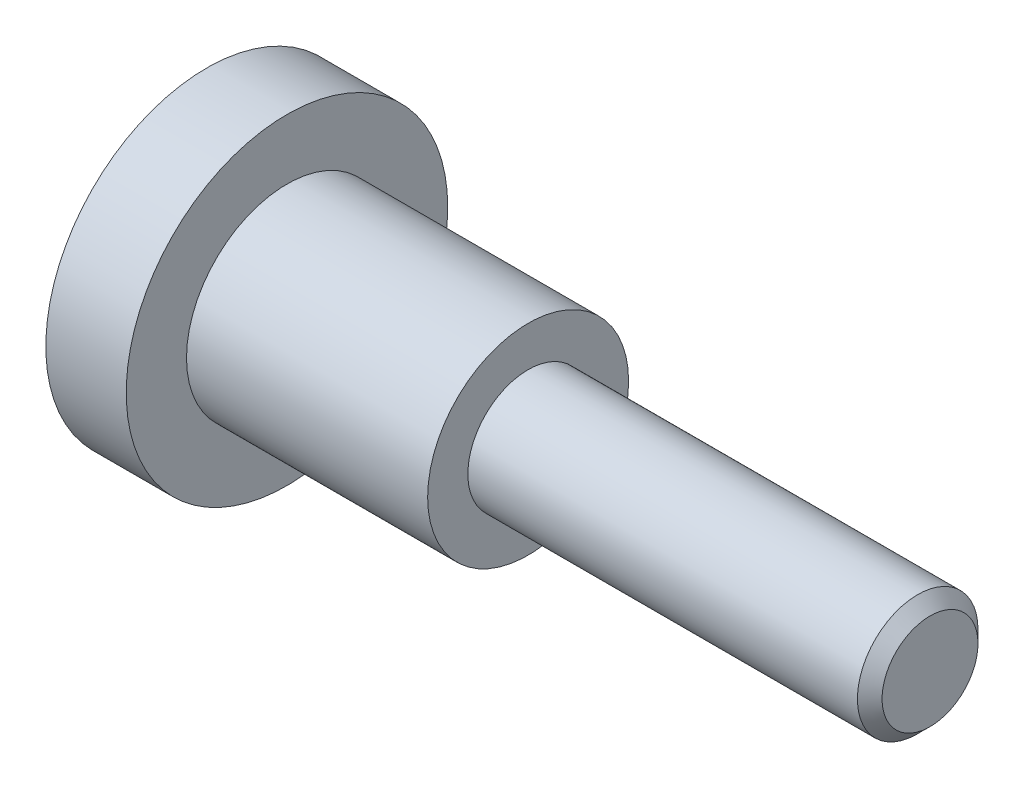
ISO-10303-21;
HEADER;
FILE_DESCRIPTION(('STEP AP214'),'2;1');
FILE_NAME('part.step','',(''),(''),'','','');
FILE_SCHEMA(('AUTOMOTIVE_DESIGN { 1 0 10303 214 1 1 1 1 }'));
ENDSEC;
DATA;
#1=APPLICATION_CONTEXT('core data for automotive mechanical design processes');
#2=APPLICATION_PROTOCOL_DEFINITION('international standard','automotive_design',2000,#1);
#3=PRODUCT_CONTEXT('',#1,'mechanical');
#4=PRODUCT('Part','Part','',(#3));
#5=PRODUCT_RELATED_PRODUCT_CATEGORY('part','',(#4));
#6=PRODUCT_DEFINITION_FORMATION('','',#4);
#7=PRODUCT_DEFINITION_CONTEXT('part definition',#1,'design');
#8=PRODUCT_DEFINITION('design','',#6,#7);
#9=PRODUCT_DEFINITION_SHAPE('','',#8);
#10=(LENGTH_UNIT() NAMED_UNIT(*) SI_UNIT(.MILLI.,.METRE.));
#11=(NAMED_UNIT(*) PLANE_ANGLE_UNIT() SI_UNIT($,.RADIAN.));
#12=(NAMED_UNIT(*) SI_UNIT($,.STERADIAN.) SOLID_ANGLE_UNIT());
#13=UNCERTAINTY_MEASURE_WITH_UNIT(LENGTH_MEASURE(1.E-05),#10,'distance_accuracy_value','');
#14=(GEOMETRIC_REPRESENTATION_CONTEXT(3) GLOBAL_UNCERTAINTY_ASSIGNED_CONTEXT((#13)) GLOBAL_UNIT_ASSIGNED_CONTEXT((#10,
#11,#12)) REPRESENTATION_CONTEXT('',''));
#15=CARTESIAN_POINT('',(0.,0.,0.));
#16=DIRECTION('',(0.,0.,1.));
#17=DIRECTION('',(1.,0.,0.));
#18=AXIS2_PLACEMENT_3D('',#15,#16,#17);
#19=CARTESIAN_POINT('',(-6.,0.,0.));
#20=DIRECTION('',(-1.,0.,0.));
#21=DIRECTION('',(0.,0.,1.));
#22=AXIS2_PLACEMENT_3D('',#19,#20,#21);
#23=PLANE('',#22);
#24=DIRECTION('',(0.,-1.,0.));
#25=VECTOR('',#24,1.);
#26=CARTESIAN_POINT('',(-6.,0.57735026918963,-1.));
#27=LINE('',#26,#25);
#28=CARTESIAN_POINT('',(-6.,0.57735026918963,-1.));
#29=VERTEX_POINT('',#28);
#30=CARTESIAN_POINT('',(-6.,0.,-1.));
#31=VERTEX_POINT('',#30);
#32=EDGE_CURVE('E229',#29,#31,#27,.T.);
#33=ORIENTED_EDGE('',*,*,#32,.T.);
#34=CARTESIAN_POINT('',(-6.,0.,0.));
#35=DIRECTION('',(1.,0.,0.));
#36=DIRECTION('',(0.,0.,-1.));
#37=AXIS2_PLACEMENT_3D('',#34,#35,#36);
#38=CIRCLE('',#37,1.);
#39=CARTESIAN_POINT('',(-6.,0.866025403784439,-0.5));
#40=VERTEX_POINT('',#39);
#41=EDGE_CURVE('E50',#31,#40,#38,.T.);
#42=ORIENTED_EDGE('',*,*,#41,.T.);
#43=DIRECTION('',(0.,-0.5,-0.866025403784439));
#44=VECTOR('',#43,1.);
#45=CARTESIAN_POINT('',(-6.,1.15470053837927,0.));
#46=LINE('',#45,#44);
#47=EDGE_CURVE('E257',#40,#29,#46,.T.);
#48=ORIENTED_EDGE('',*,*,#47,.T.);
#49=EDGE_LOOP('',(#33,#42,#48));
#50=FACE_BOUND('',#49,.T.);
#51=ADVANCED_FACE('F34',(#50),#23,.T.);
#52=CARTESIAN_POINT('',(-6.,1.15470053837927,0.));
#53=VERTEX_POINT('',#52);
#54=EDGE_CURVE('E255',#53,#40,#46,.T.);
#55=ORIENTED_EDGE('',*,*,#54,.T.);
#56=CARTESIAN_POINT('',(-6.,0.866025403784439,0.5));
#57=VERTEX_POINT('',#56);
#58=EDGE_CURVE('E201',#40,#57,#38,.T.);
#59=ORIENTED_EDGE('',*,*,#58,.T.);
#60=DIRECTION('',(0.,0.5,-0.866025403784439));
#61=VECTOR('',#60,1.);
#62=CARTESIAN_POINT('',(-6.,0.57735026918963,1.00000000000004));
#63=LINE('',#62,#61);
#64=EDGE_CURVE('E261',#57,#53,#63,.T.);
#65=ORIENTED_EDGE('',*,*,#64,.T.);
#66=EDGE_LOOP('',(#55,#59,#65));
#67=FACE_BOUND('',#66,.T.);
#68=ADVANCED_FACE('F122',(#67),#23,.T.);
#69=CARTESIAN_POINT('',(-6.,0.57735026918963,1.00000000000004));
#70=VERTEX_POINT('',#69);
#71=EDGE_CURVE('E258',#70,#57,#63,.T.);
#72=ORIENTED_EDGE('',*,*,#71,.T.);
#73=CARTESIAN_POINT('',(-6.,0.,1.));
#74=VERTEX_POINT('',#73);
#75=EDGE_CURVE('E204',#57,#74,#38,.T.);
#76=ORIENTED_EDGE('',*,*,#75,.T.);
#77=DIRECTION('',(0.,1.,0.));
#78=VECTOR('',#77,1.);
#79=CARTESIAN_POINT('',(-6.,-0.57735026918963,1.00000000000004));
#80=LINE('',#79,#78);
#81=EDGE_CURVE('E265',#74,#70,#80,.T.);
#82=ORIENTED_EDGE('',*,*,#81,.T.);
#83=EDGE_LOOP('',(#72,#76,#82));
#84=FACE_BOUND('',#83,.T.);
#85=ADVANCED_FACE('F127',(#84),#23,.T.);
#86=CARTESIAN_POINT('',(-6.,-0.57735026918963,1.00000000000004));
#87=VERTEX_POINT('',#86);
#88=EDGE_CURVE('E262',#87,#74,#80,.T.);
#89=ORIENTED_EDGE('',*,*,#88,.T.);
#90=CARTESIAN_POINT('',(-6.,-0.866025403784439,0.5));
#91=VERTEX_POINT('',#90);
#92=EDGE_CURVE('E209',#74,#91,#38,.T.);
#93=ORIENTED_EDGE('',*,*,#92,.T.);
#94=DIRECTION('',(0.,0.5,0.866025403784439));
#95=VECTOR('',#94,1.);
#96=CARTESIAN_POINT('',(-6.,-1.15470053837927,0.));
#97=LINE('',#96,#95);
#98=EDGE_CURVE('E268',#91,#87,#97,.T.);
#99=ORIENTED_EDGE('',*,*,#98,.T.);
#100=EDGE_LOOP('',(#89,#93,#99));
#101=FACE_BOUND('',#100,.T.);
#102=ADVANCED_FACE('F182',(#101),#23,.T.);
#103=CARTESIAN_POINT('',(-6.,-1.15470053837927,0.));
#104=VERTEX_POINT('',#103);
#105=EDGE_CURVE('E266',#104,#91,#97,.T.);
#106=ORIENTED_EDGE('',*,*,#105,.T.);
#107=CARTESIAN_POINT('',(-6.,-0.866025403784439,-0.5));
#108=VERTEX_POINT('',#107);
#109=EDGE_CURVE('E215',#91,#108,#38,.T.);
#110=ORIENTED_EDGE('',*,*,#109,.T.);
#111=DIRECTION('',(0.,-0.5,0.866025403784438));
#112=VECTOR('',#111,1.);
#113=CARTESIAN_POINT('',(-6.,-0.57735026918963,-1.));
#114=LINE('',#113,#112);
#115=EDGE_CURVE('E241',#108,#104,#114,.T.);
#116=ORIENTED_EDGE('',*,*,#115,.T.);
#117=EDGE_LOOP('',(#106,#110,#116));
#118=FACE_BOUND('',#117,.T.);
#119=ADVANCED_FACE('F120',(#118),#23,.T.);
#120=CARTESIAN_POINT('',(-8.,0.,0.));
#121=DIRECTION('',(1.,0.,0.));
#122=DIRECTION('',(0.,0.,-1.));
#123=AXIS2_PLACEMENT_3D('',#120,#121,#122);
#124=CYLINDRICAL_SURFACE('',#123,4.);
#125=CARTESIAN_POINT('',(-8.,0.,0.));
#126=DIRECTION('',(1.,0.,0.));
#127=DIRECTION('',(0.,0.,-1.));
#128=AXIS2_PLACEMENT_3D('',#125,#126,#127);
#129=CIRCLE('',#128,4.);
#130=CARTESIAN_POINT('',(-8.,0.,-4.));
#131=VERTEX_POINT('',#130);
#132=EDGE_CURVE('E187',#131,#131,#129,.T.);
#133=ORIENTED_EDGE('',*,*,#132,.T.);
#134=EDGE_LOOP('',(#133));
#135=FACE_BOUND('',#134,.T.);
#136=CARTESIAN_POINT('',(-6.,0.,0.));
#137=DIRECTION('',(1.,0.,0.));
#138=DIRECTION('',(0.,0.,-1.));
#139=AXIS2_PLACEMENT_3D('',#136,#137,#138);
#140=CIRCLE('',#139,4.);
#141=CARTESIAN_POINT('',(-6.,0.,-4.));
#142=VERTEX_POINT('',#141);
#143=EDGE_CURVE('E190',#142,#142,#140,.T.);
#144=ORIENTED_EDGE('',*,*,#143,.F.);
#145=EDGE_LOOP('',(#144));
#146=FACE_BOUND('',#145,.T.);
#147=ADVANCED_FACE('F175',(#135,#146),#124,.T.);
#148=CARTESIAN_POINT('',(-8.,4.,0.));
#149=DIRECTION('',(-1.,0.,0.));
#150=DIRECTION('',(0.,0.,1.));
#151=AXIS2_PLACEMENT_3D('',#148,#149,#150);
#152=PLANE('',#151);
#153=DIRECTION('',(0.,-0.5,0.866025403784438));
#154=VECTOR('',#153,1.);
#155=CARTESIAN_POINT('',(-8.,-0.57735026918963,-1.));
#156=LINE('',#155,#154);
#157=CARTESIAN_POINT('',(-8.,-0.57735026918963,-1.));
#158=VERTEX_POINT('',#157);
#159=CARTESIAN_POINT('',(-8.,-1.15470053837927,0.));
#160=VERTEX_POINT('',#159);
#161=EDGE_CURVE('E58',#158,#160,#156,.T.);
#162=ORIENTED_EDGE('',*,*,#161,.F.);
#163=DIRECTION('',(0.,-1.,0.));
#164=VECTOR('',#163,1.);
#165=CARTESIAN_POINT('',(-8.,0.57735026918963,-1.));
#166=LINE('',#165,#164);
#167=CARTESIAN_POINT('',(-8.,0.57735026918963,-1.));
#168=VERTEX_POINT('',#167);
#169=EDGE_CURVE('E238',#168,#158,#166,.T.);
#170=ORIENTED_EDGE('',*,*,#169,.F.);
#171=DIRECTION('',(0.,-0.5,-0.866025403784439));
#172=VECTOR('',#171,1.);
#173=CARTESIAN_POINT('',(-8.,1.15470053837927,0.));
#174=LINE('',#173,#172);
#175=CARTESIAN_POINT('',(-8.,1.15470053837927,0.));
#176=VERTEX_POINT('',#175);
#177=EDGE_CURVE('E242',#176,#168,#174,.T.);
#178=ORIENTED_EDGE('',*,*,#177,.F.);
#179=DIRECTION('',(0.,0.5,-0.866025403784439));
#180=VECTOR('',#179,1.);
#181=CARTESIAN_POINT('',(-8.,0.57735026918963,1.00000000000004));
#182=LINE('',#181,#180);
#183=CARTESIAN_POINT('',(-8.,0.57735026918963,1.00000000000004));
#184=VERTEX_POINT('',#183);
#185=EDGE_CURVE('E245',#184,#176,#182,.T.);
#186=ORIENTED_EDGE('',*,*,#185,.F.);
#187=DIRECTION('',(0.,1.,0.));
#188=VECTOR('',#187,1.);
#189=CARTESIAN_POINT('',(-8.,-0.57735026918963,1.00000000000004));
#190=LINE('',#189,#188);
#191=CARTESIAN_POINT('',(-8.,-0.57735026918963,1.00000000000004));
#192=VERTEX_POINT('',#191);
#193=EDGE_CURVE('E248',#192,#184,#190,.T.);
#194=ORIENTED_EDGE('',*,*,#193,.F.);
#195=DIRECTION('',(0.,0.5,0.866025403784439));
#196=VECTOR('',#195,1.);
#197=CARTESIAN_POINT('',(-8.,-1.15470053837927,0.));
#198=LINE('',#197,#196);
#199=EDGE_CURVE('E213',#160,#192,#198,.T.);
#200=ORIENTED_EDGE('',*,*,#199,.F.);
#201=EDGE_LOOP('',(#162,#170,#178,#186,#194,#200));
#202=FACE_BOUND('',#201,.T.);
#203=ORIENTED_EDGE('',*,*,#132,.F.);
#204=EDGE_LOOP('',(#203));
#205=FACE_BOUND('',#204,.T.);
#206=ADVANCED_FACE('F172',(#202,#205),#152,.T.);
#207=CARTESIAN_POINT('',(-6.,0.,0.));
#208=DIRECTION('',(1.,0.,0.));
#209=DIRECTION('',(0.,0.,-1.));
#210=AXIS2_PLACEMENT_3D('',#207,#208,#209);
#211=PLANE('',#210);
#212=CARTESIAN_POINT('',(-6.,0.,0.));
#213=DIRECTION('',(1.,0.,0.));
#214=DIRECTION('',(0.,0.,-1.));
#215=AXIS2_PLACEMENT_3D('',#212,#213,#214);
#216=CIRCLE('',#215,2.5);
#217=CARTESIAN_POINT('',(-6.,0.,-2.5));
#218=VERTEX_POINT('',#217);
#219=EDGE_CURVE('E194',#218,#218,#216,.T.);
#220=ORIENTED_EDGE('',*,*,#219,.F.);
#221=EDGE_LOOP('',(#220));
#222=FACE_BOUND('',#221,.T.);
#223=ORIENTED_EDGE('',*,*,#143,.T.);
#224=EDGE_LOOP('',(#223));
#225=FACE_BOUND('',#224,.T.);
#226=ADVANCED_FACE('F168',(#222,#225),#211,.T.);
#227=CARTESIAN_POINT('',(0.,0.,0.));
#228=DIRECTION('',(-1.,0.,0.));
#229=DIRECTION('',(0.,0.,1.));
#230=AXIS2_PLACEMENT_3D('',#227,#228,#229);
#231=CYLINDRICAL_SURFACE('',#230,2.5);
#232=CARTESIAN_POINT('',(0.,0.,0.));
#233=DIRECTION('',(1.,0.,0.));
#234=DIRECTION('',(0.,0.,-1.));
#235=AXIS2_PLACEMENT_3D('',#232,#233,#234);
#236=CIRCLE('',#235,2.5);
#237=CARTESIAN_POINT('',(0.,0.,-2.5));
#238=VERTEX_POINT('',#237);
#239=EDGE_CURVE('E192',#238,#238,#236,.T.);
#240=ORIENTED_EDGE('',*,*,#239,.F.);
#241=EDGE_LOOP('',(#240));
#242=FACE_BOUND('',#241,.T.);
#243=ORIENTED_EDGE('',*,*,#219,.T.);
#244=EDGE_LOOP('',(#243));
#245=FACE_BOUND('',#244,.T.);
#246=ADVANCED_FACE('F164',(#242,#245),#231,.T.);
#247=CARTESIAN_POINT('',(0.,0.,0.));
#248=DIRECTION('',(1.,0.,0.));
#249=DIRECTION('',(0.,0.,-1.));
#250=AXIS2_PLACEMENT_3D('',#247,#248,#249);
#251=PLANE('',#250);
#252=CARTESIAN_POINT('',(0.,0.,0.));
#253=DIRECTION('',(1.,0.,0.));
#254=DIRECTION('',(0.,0.,-1.));
#255=AXIS2_PLACEMENT_3D('',#252,#253,#254);
#256=CIRCLE('',#255,1.5);
#257=CARTESIAN_POINT('',(0.,0.,-1.5));
#258=VERTEX_POINT('',#257);
#259=EDGE_CURVE('E216',#258,#258,#256,.T.);
#260=ORIENTED_EDGE('',*,*,#259,.F.);
#261=EDGE_LOOP('',(#260));
#262=FACE_BOUND('',#261,.T.);
#263=ORIENTED_EDGE('',*,*,#239,.T.);
#264=EDGE_LOOP('',(#263));
#265=FACE_BOUND('',#264,.T.);
#266=ADVANCED_FACE('F160',(#262,#265),#251,.T.);
#267=CARTESIAN_POINT('',(10.,0.,0.));
#268=DIRECTION('',(-1.,0.,0.));
#269=DIRECTION('',(0.,0.,1.));
#270=AXIS2_PLACEMENT_3D('',#267,#268,#269);
#271=CYLINDRICAL_SURFACE('',#270,1.5);
#272=CARTESIAN_POINT('',(9.6935,0.,0.));
#273=DIRECTION('',(1.,0.,0.));
#274=DIRECTION('',(0.,0.,-1.));
#275=AXIS2_PLACEMENT_3D('',#272,#273,#274);
#276=CIRCLE('',#275,1.5);
#277=CARTESIAN_POINT('',(9.6935,0.,-1.5));
#278=VERTEX_POINT('',#277);
#279=EDGE_CURVE('E11',#278,#278,#276,.F.);
#280=ORIENTED_EDGE('',*,*,#279,.T.);
#281=EDGE_LOOP('',(#280));
#282=FACE_BOUND('',#281,.T.);
#283=ORIENTED_EDGE('',*,*,#259,.T.);
#284=EDGE_LOOP('',(#283));
#285=FACE_BOUND('',#284,.T.);
#286=ADVANCED_FACE('F156',(#282,#285),#271,.T.);
#287=CARTESIAN_POINT('',(10.,0.,0.));
#288=DIRECTION('',(1.,0.,0.));
#289=DIRECTION('',(0.,0.,-1.));
#290=AXIS2_PLACEMENT_3D('',#287,#288,#289);
#291=PLANE('',#290);
#292=CARTESIAN_POINT('',(10.,0.,0.));
#293=DIRECTION('',(1.,0.,0.));
#294=DIRECTION('',(0.,0.,-1.));
#295=AXIS2_PLACEMENT_3D('',#292,#293,#294);
#296=CIRCLE('',#295,1.1935);
#297=CARTESIAN_POINT('',(10.,0.,-1.1935));
#298=VERTEX_POINT('',#297);
#299=EDGE_CURVE('E43',#298,#298,#296,.T.);
#300=ORIENTED_EDGE('',*,*,#299,.T.);
#301=EDGE_LOOP('',(#300));
#302=FACE_BOUND('',#301,.T.);
#303=ADVANCED_FACE('F153',(#302),#291,.T.);
#304=CARTESIAN_POINT('',(-6.,-0.57735026918963,-1.));
#305=DIRECTION('',(0.,-0.866025403784439,-0.5));
#306=DIRECTION('',(0.,0.5,-0.866025403784438));
#307=AXIS2_PLACEMENT_3D('',#304,#305,#306);
#308=PLANE('',#307);
#309=ORIENTED_EDGE('',*,*,#161,.T.);
#310=DIRECTION('',(-1.,0.,0.));
#311=VECTOR('',#310,1.);
#312=CARTESIAN_POINT('',(-6.,-1.15470053837927,0.));
#313=LINE('',#312,#311);
#314=EDGE_CURVE('E226',#104,#160,#313,.T.);
#315=ORIENTED_EDGE('',*,*,#314,.F.);
#316=ORIENTED_EDGE('',*,*,#115,.F.);
#317=CARTESIAN_POINT('',(-6.,-0.57735026918963,-1.));
#318=VERTEX_POINT('',#317);
#319=EDGE_CURVE('E269',#318,#108,#114,.T.);
#320=ORIENTED_EDGE('',*,*,#319,.F.);
#321=DIRECTION('',(-1.,0.,0.));
#322=VECTOR('',#321,1.);
#323=CARTESIAN_POINT('',(-6.,-0.57735026918963,-1.));
#324=LINE('',#323,#322);
#325=EDGE_CURVE('E197',#318,#158,#324,.T.);
#326=ORIENTED_EDGE('',*,*,#325,.T.);
#327=EDGE_LOOP('',(#309,#315,#316,#320,#326));
#328=FACE_BOUND('',#327,.T.);
#329=ADVANCED_FACE('F135',(#328),#308,.F.);
#330=CARTESIAN_POINT('',(-6.,0.57735026918963,-1.));
#331=DIRECTION('',(0.,0.,-1.));
#332=DIRECTION('',(0.,1.,0.));
#333=AXIS2_PLACEMENT_3D('',#330,#331,#332);
#334=PLANE('',#333);
#335=ORIENTED_EDGE('',*,*,#169,.T.);
#336=ORIENTED_EDGE('',*,*,#325,.F.);
#337=EDGE_CURVE('E254',#31,#318,#27,.T.);
#338=ORIENTED_EDGE('',*,*,#337,.F.);
#339=ORIENTED_EDGE('',*,*,#32,.F.);
#340=DIRECTION('',(-1.,0.,0.));
#341=VECTOR('',#340,1.);
#342=CARTESIAN_POINT('',(-6.,0.57735026918963,-1.));
#343=LINE('',#342,#341);
#344=EDGE_CURVE('E235',#29,#168,#343,.T.);
#345=ORIENTED_EDGE('',*,*,#344,.T.);
#346=EDGE_LOOP('',(#335,#336,#338,#339,#345));
#347=FACE_BOUND('',#346,.T.);
#348=ADVANCED_FACE('F131',(#347),#334,.F.);
#349=CARTESIAN_POINT('',(-6.,1.15470053837927,0.));
#350=DIRECTION('',(0.,0.866025403784439,-0.5));
#351=DIRECTION('',(0.,0.5,0.866025403784439));
#352=AXIS2_PLACEMENT_3D('',#349,#350,#351);
#353=PLANE('',#352);
#354=ORIENTED_EDGE('',*,*,#177,.T.);
#355=ORIENTED_EDGE('',*,*,#344,.F.);
#356=ORIENTED_EDGE('',*,*,#47,.F.);
#357=ORIENTED_EDGE('',*,*,#54,.F.);
#358=DIRECTION('',(-1.,0.,0.));
#359=VECTOR('',#358,1.);
#360=CARTESIAN_POINT('',(-6.,1.15470053837927,0.));
#361=LINE('',#360,#359);
#362=EDGE_CURVE('E233',#53,#176,#361,.T.);
#363=ORIENTED_EDGE('',*,*,#362,.T.);
#364=EDGE_LOOP('',(#354,#355,#356,#357,#363));
#365=FACE_BOUND('',#364,.T.);
#366=ADVANCED_FACE('F134',(#365),#353,.F.);
#367=CARTESIAN_POINT('',(-6.,0.57735026918963,1.00000000000004));
#368=DIRECTION('',(0.,0.866025403784439,0.5));
#369=DIRECTION('',(0.,-0.5,0.866025403784439));
#370=AXIS2_PLACEMENT_3D('',#367,#368,#369);
#371=PLANE('',#370);
#372=ORIENTED_EDGE('',*,*,#185,.T.);
#373=ORIENTED_EDGE('',*,*,#362,.F.);
#374=ORIENTED_EDGE('',*,*,#64,.F.);
#375=ORIENTED_EDGE('',*,*,#71,.F.);
#376=DIRECTION('',(-1.,0.,0.));
#377=VECTOR('',#376,1.);
#378=CARTESIAN_POINT('',(-6.,0.57735026918963,1.00000000000004));
#379=LINE('',#378,#377);
#380=EDGE_CURVE('E231',#70,#184,#379,.T.);
#381=ORIENTED_EDGE('',*,*,#380,.T.);
#382=EDGE_LOOP('',(#372,#373,#374,#375,#381));
#383=FACE_BOUND('',#382,.T.);
#384=ADVANCED_FACE('F139',(#383),#371,.F.);
#385=CARTESIAN_POINT('',(-6.,-0.57735026918963,1.00000000000004));
#386=DIRECTION('',(0.,0.,1.));
#387=DIRECTION('',(1.,0.,0.));
#388=AXIS2_PLACEMENT_3D('',#385,#386,#387);
#389=PLANE('',#388);
#390=ORIENTED_EDGE('',*,*,#193,.T.);
#391=ORIENTED_EDGE('',*,*,#380,.F.);
#392=ORIENTED_EDGE('',*,*,#81,.F.);
#393=ORIENTED_EDGE('',*,*,#88,.F.);
#394=DIRECTION('',(-1.,0.,0.));
#395=VECTOR('',#394,1.);
#396=CARTESIAN_POINT('',(-6.,-0.57735026918963,1.00000000000004));
#397=LINE('',#396,#395);
#398=EDGE_CURVE('E228',#87,#192,#397,.T.);
#399=ORIENTED_EDGE('',*,*,#398,.T.);
#400=EDGE_LOOP('',(#390,#391,#392,#393,#399));
#401=FACE_BOUND('',#400,.T.);
#402=ADVANCED_FACE('F143',(#401),#389,.F.);
#403=CARTESIAN_POINT('',(-6.,-1.15470053837927,0.));
#404=DIRECTION('',(0.,-0.866025403784439,0.5));
#405=DIRECTION('',(0.,-0.5,-0.866025403784439));
#406=AXIS2_PLACEMENT_3D('',#403,#404,#405);
#407=PLANE('',#406);
#408=ORIENTED_EDGE('',*,*,#199,.T.);
#409=ORIENTED_EDGE('',*,*,#398,.F.);
#410=ORIENTED_EDGE('',*,*,#98,.F.);
#411=ORIENTED_EDGE('',*,*,#105,.F.);
#412=ORIENTED_EDGE('',*,*,#314,.T.);
#413=EDGE_LOOP('',(#408,#409,#410,#411,#412));
#414=FACE_BOUND('',#413,.T.);
#415=ADVANCED_FACE('F117',(#414),#407,.F.);
#416=ORIENTED_EDGE('',*,*,#319,.T.);
#417=EDGE_CURVE('E211',#108,#31,#38,.T.);
#418=ORIENTED_EDGE('',*,*,#417,.T.);
#419=ORIENTED_EDGE('',*,*,#337,.T.);
#420=EDGE_LOOP('',(#416,#418,#419));
#421=FACE_BOUND('',#420,.T.);
#422=ADVANCED_FACE('F110',(#421),#23,.T.);
#423=CARTESIAN_POINT('',(-5.4226497308104,0.,0.));
#424=DIRECTION('',(-1.,0.,0.));
#425=DIRECTION('',(0.,0.,1.));
#426=AXIS2_PLACEMENT_3D('',#423,#424,#425);
#427=CONICAL_SURFACE('',#426,0.,1.04719755119662);
#428=ORIENTED_EDGE('',*,*,#41,.F.);
#429=ORIENTED_EDGE('',*,*,#417,.F.);
#430=ORIENTED_EDGE('',*,*,#109,.F.);
#431=ORIENTED_EDGE('',*,*,#92,.F.);
#432=ORIENTED_EDGE('',*,*,#75,.F.);
#433=ORIENTED_EDGE('',*,*,#58,.F.);
#434=EDGE_LOOP('',(#428,#429,#430,#431,#432,#433));
#435=FACE_BOUND('',#434,.T.);
#436=CARTESIAN_POINT('',(-5.4226497308104,0.,0.));
#437=VERTEX_POINT('',#436);
#438=VERTEX_LOOP('',#437);
#439=FACE_BOUND('',#438,.T.);
#440=ADVANCED_FACE('F108',(#435,#439),#427,.F.);
#441=CARTESIAN_POINT('',(10.,0.,0.));
#442=DIRECTION('',(-1.,0.,0.));
#443=DIRECTION('',(0.,0.,1.));
#444=AXIS2_PLACEMENT_3D('',#441,#442,#443);
#445=CONICAL_SURFACE('',#444,1.1935,0.785398163397446);
#446=ORIENTED_EDGE('',*,*,#279,.F.);
#447=EDGE_LOOP('',(#446));
#448=FACE_BOUND('',#447,.T.);
#449=ORIENTED_EDGE('',*,*,#299,.F.);
#450=EDGE_LOOP('',(#449));
#451=FACE_BOUND('',#450,.T.);
#452=ADVANCED_FACE('F37',(#448,#451),#445,.T.);
#453=CLOSED_SHELL('',(#51,#68,#85,#102,#119,#147,#206,#226,#246,#266,#286,#303,#329,#348,#366,
#384,#402,#415,#422,#440,#452));
#454=MANIFOLD_SOLID_BREP('B2',#453);
#455=ADVANCED_BREP_SHAPE_REPRESENTATION('',(#18,#454),#14);
#456=SHAPE_DEFINITION_REPRESENTATION(#9,#455);
ENDSEC;
END-ISO-10303-21;
